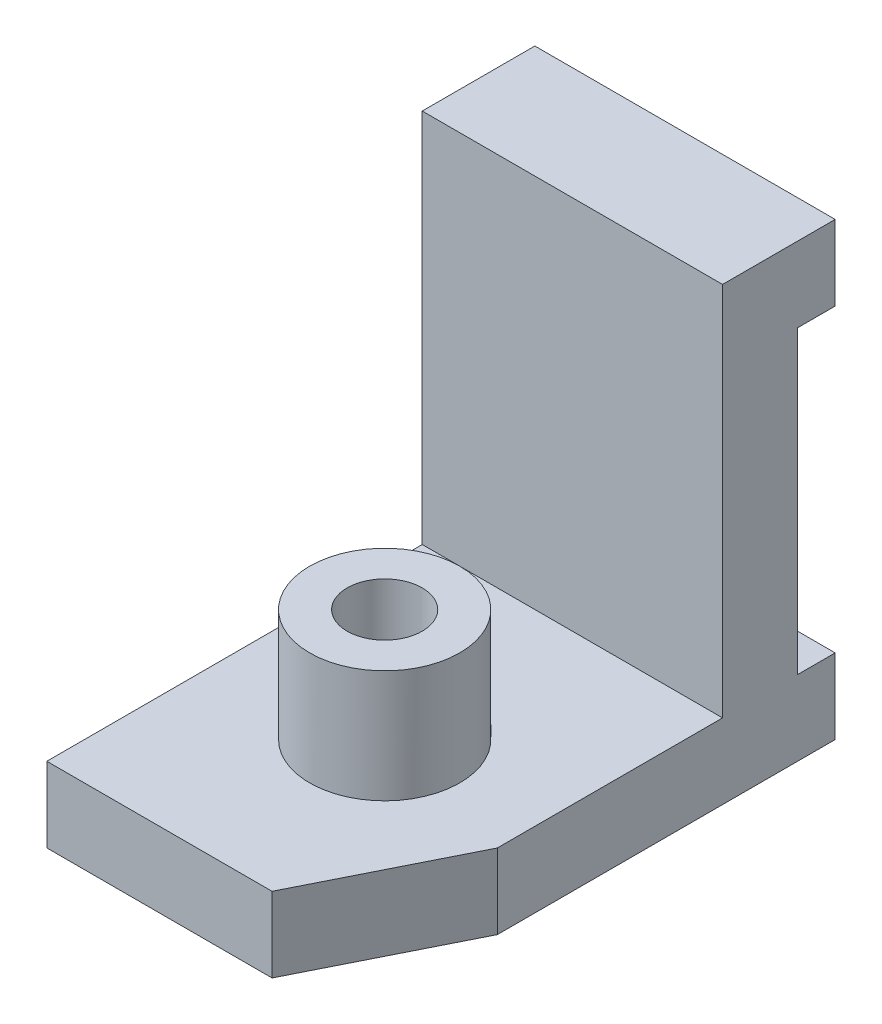
ISO-10303-21;
HEADER;
FILE_DESCRIPTION(('STEP AP214'),'2;1');
FILE_NAME('part.step','',(''),(''),'','','');
FILE_SCHEMA(('AUTOMOTIVE_DESIGN { 1 0 10303 214 1 1 1 1 }'));
ENDSEC;
DATA;
#1=APPLICATION_CONTEXT('core data for automotive mechanical design processes');
#2=APPLICATION_PROTOCOL_DEFINITION('international standard','automotive_design',2000,#1);
#3=PRODUCT_CONTEXT('',#1,'mechanical');
#4=PRODUCT('Part','Part','',(#3));
#5=PRODUCT_RELATED_PRODUCT_CATEGORY('part','',(#4));
#6=PRODUCT_DEFINITION_FORMATION('','',#4);
#7=PRODUCT_DEFINITION_CONTEXT('part definition',#1,'design');
#8=PRODUCT_DEFINITION('design','',#6,#7);
#9=PRODUCT_DEFINITION_SHAPE('','',#8);
#10=(LENGTH_UNIT() NAMED_UNIT(*) SI_UNIT(.MILLI.,.METRE.));
#11=(NAMED_UNIT(*) PLANE_ANGLE_UNIT() SI_UNIT($,.RADIAN.));
#12=(NAMED_UNIT(*) SI_UNIT($,.STERADIAN.) SOLID_ANGLE_UNIT());
#13=UNCERTAINTY_MEASURE_WITH_UNIT(LENGTH_MEASURE(1.E-05),#10,'distance_accuracy_value','');
#14=(GEOMETRIC_REPRESENTATION_CONTEXT(3) GLOBAL_UNCERTAINTY_ASSIGNED_CONTEXT((#13)) GLOBAL_UNIT_ASSIGNED_CONTEXT((#10,
#11,#12)) REPRESENTATION_CONTEXT('',''));
#15=CARTESIAN_POINT('',(0.,0.,0.));
#16=DIRECTION('',(0.,0.,1.));
#17=DIRECTION('',(1.,0.,0.));
#18=AXIS2_PLACEMENT_3D('',#15,#16,#17);
#19=CARTESIAN_POINT('',(40.,0.,65.));
#20=DIRECTION('',(0.,1.,0.));
#21=DIRECTION('',(0.,0.,1.));
#22=AXIS2_PLACEMENT_3D('',#19,#20,#21);
#23=PLANE('',#22);
#24=DIRECTION('',(0.,0.,-1.));
#25=VECTOR('',#24,1.);
#26=CARTESIAN_POINT('',(40.,0.,65.));
#27=LINE('',#26,#25);
#28=CARTESIAN_POINT('',(40.,0.,44.9999999999999));
#29=VERTEX_POINT('',#28);
#30=CARTESIAN_POINT('',(40.,0.,0.));
#31=VERTEX_POINT('',#30);
#32=EDGE_CURVE('E124',#29,#31,#27,.T.);
#33=ORIENTED_EDGE('',*,*,#32,.F.);
#34=DIRECTION('',(-0.447213595499956,0.,0.894427190999917));
#35=VECTOR('',#34,1.);
#36=CARTESIAN_POINT('',(40.,0.,44.9999999999999));
#37=LINE('',#36,#35);
#38=CARTESIAN_POINT('',(30.,0.,65.));
#39=VERTEX_POINT('',#38);
#40=EDGE_CURVE('E65',#29,#39,#37,.T.);
#41=ORIENTED_EDGE('',*,*,#40,.T.);
#42=DIRECTION('',(-1.,0.,0.));
#43=VECTOR('',#42,1.);
#44=CARTESIAN_POINT('',(40.,0.,65.));
#45=LINE('',#44,#43);
#46=CARTESIAN_POINT('',(0.,0.,65.));
#47=VERTEX_POINT('',#46);
#48=EDGE_CURVE('E166',#39,#47,#45,.T.);
#49=ORIENTED_EDGE('',*,*,#48,.T.);
#50=DIRECTION('',(0.,0.,-1.));
#51=VECTOR('',#50,1.);
#52=CARTESIAN_POINT('',(0.,0.,65.));
#53=LINE('',#52,#51);
#54=CARTESIAN_POINT('',(0.,0.,0.));
#55=VERTEX_POINT('',#54);
#56=EDGE_CURVE('E146',#47,#55,#53,.T.);
#57=ORIENTED_EDGE('',*,*,#56,.T.);
#58=DIRECTION('',(-1.,0.,0.));
#59=VECTOR('',#58,1.);
#60=CARTESIAN_POINT('',(40.,0.,0.));
#61=LINE('',#60,#59);
#62=EDGE_CURVE('E138',#31,#55,#61,.T.);
#63=ORIENTED_EDGE('',*,*,#62,.F.);
#64=EDGE_LOOP('',(#33,#41,#49,#57,#63));
#65=FACE_BOUND('',#64,.T.);
#66=ADVANCED_FACE('F41',(#65),#23,.F.);
#67=CARTESIAN_POINT('',(40.,0.,0.));
#68=DIRECTION('',(0.,0.,1.));
#69=DIRECTION('',(1.,0.,0.));
#70=AXIS2_PLACEMENT_3D('',#67,#68,#69);
#71=PLANE('',#70);
#72=DIRECTION('',(0.,1.,0.));
#73=VECTOR('',#72,1.);
#74=CARTESIAN_POINT('',(0.,0.,0.));
#75=LINE('',#74,#73);
#76=CARTESIAN_POINT('',(0.,10.,0.));
#77=VERTEX_POINT('',#76);
#78=EDGE_CURVE('E253',#55,#77,#75,.T.);
#79=ORIENTED_EDGE('',*,*,#78,.T.);
#80=DIRECTION('',(-1.,0.,0.));
#81=VECTOR('',#80,1.);
#82=CARTESIAN_POINT('',(40.,10.,0.));
#83=LINE('',#82,#81);
#84=CARTESIAN_POINT('',(40.,10.,0.));
#85=VERTEX_POINT('',#84);
#86=EDGE_CURVE('E141',#85,#77,#83,.T.);
#87=ORIENTED_EDGE('',*,*,#86,.F.);
#88=DIRECTION('',(0.,1.,0.));
#89=VECTOR('',#88,1.);
#90=CARTESIAN_POINT('',(40.,0.,0.));
#91=LINE('',#90,#89);
#92=EDGE_CURVE('E128',#31,#85,#91,.T.);
#93=ORIENTED_EDGE('',*,*,#92,.F.);
#94=ORIENTED_EDGE('',*,*,#62,.T.);
#95=EDGE_LOOP('',(#79,#87,#93,#94));
#96=FACE_BOUND('',#95,.T.);
#97=ADVANCED_FACE('F137',(#96),#71,.F.);
#98=CARTESIAN_POINT('',(40.,10.,0.));
#99=DIRECTION('',(0.,-1.,0.));
#100=DIRECTION('',(0.,0.,-1.));
#101=AXIS2_PLACEMENT_3D('',#98,#99,#100);
#102=PLANE('',#101);
#103=DIRECTION('',(0.,0.,1.));
#104=VECTOR('',#103,1.);
#105=CARTESIAN_POINT('',(0.,10.,0.));
#106=LINE('',#105,#104);
#107=CARTESIAN_POINT('',(0.,10.,5.));
#108=VERTEX_POINT('',#107);
#109=EDGE_CURVE('E255',#77,#108,#106,.T.);
#110=ORIENTED_EDGE('',*,*,#109,.T.);
#111=DIRECTION('',(-1.,0.,0.));
#112=VECTOR('',#111,1.);
#113=CARTESIAN_POINT('',(40.,10.,5.));
#114=LINE('',#113,#112);
#115=CARTESIAN_POINT('',(40.,10.,5.));
#116=VERTEX_POINT('',#115);
#117=EDGE_CURVE('E149',#116,#108,#114,.T.);
#118=ORIENTED_EDGE('',*,*,#117,.F.);
#119=DIRECTION('',(0.,0.,1.));
#120=VECTOR('',#119,1.);
#121=CARTESIAN_POINT('',(40.,10.,0.));
#122=LINE('',#121,#120);
#123=EDGE_CURVE('E143',#85,#116,#122,.T.);
#124=ORIENTED_EDGE('',*,*,#123,.F.);
#125=ORIENTED_EDGE('',*,*,#86,.T.);
#126=EDGE_LOOP('',(#110,#118,#124,#125));
#127=FACE_BOUND('',#126,.T.);
#128=ADVANCED_FACE('F187',(#127),#102,.F.);
#129=CARTESIAN_POINT('',(40.,10.,5.));
#130=DIRECTION('',(0.,0.,1.));
#131=DIRECTION('',(1.,0.,0.));
#132=AXIS2_PLACEMENT_3D('',#129,#130,#131);
#133=PLANE('',#132);
#134=DIRECTION('',(0.,1.,0.));
#135=VECTOR('',#134,1.);
#136=CARTESIAN_POINT('',(0.,10.,5.));
#137=LINE('',#136,#135);
#138=CARTESIAN_POINT('',(0.,50.,5.));
#139=VERTEX_POINT('',#138);
#140=EDGE_CURVE('E257',#108,#139,#137,.T.);
#141=ORIENTED_EDGE('',*,*,#140,.T.);
#142=DIRECTION('',(-1.,0.,0.));
#143=VECTOR('',#142,1.);
#144=CARTESIAN_POINT('',(40.,50.,5.));
#145=LINE('',#144,#143);
#146=CARTESIAN_POINT('',(40.,50.,5.));
#147=VERTEX_POINT('',#146);
#148=EDGE_CURVE('E284',#147,#139,#145,.T.);
#149=ORIENTED_EDGE('',*,*,#148,.F.);
#150=DIRECTION('',(0.,1.,0.));
#151=VECTOR('',#150,1.);
#152=CARTESIAN_POINT('',(40.,10.,5.));
#153=LINE('',#152,#151);
#154=EDGE_CURVE('E243',#116,#147,#153,.T.);
#155=ORIENTED_EDGE('',*,*,#154,.F.);
#156=ORIENTED_EDGE('',*,*,#117,.T.);
#157=EDGE_LOOP('',(#141,#149,#155,#156));
#158=FACE_BOUND('',#157,.T.);
#159=ADVANCED_FACE('F192',(#158),#133,.F.);
#160=CARTESIAN_POINT('',(40.,50.,5.));
#161=DIRECTION('',(0.,1.,0.));
#162=DIRECTION('',(0.,0.,1.));
#163=AXIS2_PLACEMENT_3D('',#160,#161,#162);
#164=PLANE('',#163);
#165=DIRECTION('',(0.,0.,-1.));
#166=VECTOR('',#165,1.);
#167=CARTESIAN_POINT('',(0.,50.,5.));
#168=LINE('',#167,#166);
#169=CARTESIAN_POINT('',(0.,50.,0.));
#170=VERTEX_POINT('',#169);
#171=EDGE_CURVE('E259',#139,#170,#168,.T.);
#172=ORIENTED_EDGE('',*,*,#171,.T.);
#173=DIRECTION('',(-1.,0.,0.));
#174=VECTOR('',#173,1.);
#175=CARTESIAN_POINT('',(40.,50.,0.));
#176=LINE('',#175,#174);
#177=CARTESIAN_POINT('',(40.,50.,0.));
#178=VERTEX_POINT('',#177);
#179=EDGE_CURVE('E281',#178,#170,#176,.T.);
#180=ORIENTED_EDGE('',*,*,#179,.F.);
#181=DIRECTION('',(0.,0.,-1.));
#182=VECTOR('',#181,1.);
#183=CARTESIAN_POINT('',(40.,50.,5.));
#184=LINE('',#183,#182);
#185=EDGE_CURVE('E245',#147,#178,#184,.T.);
#186=ORIENTED_EDGE('',*,*,#185,.F.);
#187=ORIENTED_EDGE('',*,*,#148,.T.);
#188=EDGE_LOOP('',(#172,#180,#186,#187));
#189=FACE_BOUND('',#188,.T.);
#190=ADVANCED_FACE('F196',(#189),#164,.F.);
#191=CARTESIAN_POINT('',(40.,50.,0.));
#192=DIRECTION('',(0.,0.,1.));
#193=DIRECTION('',(1.,0.,0.));
#194=AXIS2_PLACEMENT_3D('',#191,#192,#193);
#195=PLANE('',#194);
#196=DIRECTION('',(0.,1.,0.));
#197=VECTOR('',#196,1.);
#198=CARTESIAN_POINT('',(0.,50.,0.));
#199=LINE('',#198,#197);
#200=CARTESIAN_POINT('',(0.,60.,0.));
#201=VERTEX_POINT('',#200);
#202=EDGE_CURVE('E261',#170,#201,#199,.T.);
#203=ORIENTED_EDGE('',*,*,#202,.T.);
#204=DIRECTION('',(-1.,0.,0.));
#205=VECTOR('',#204,1.);
#206=CARTESIAN_POINT('',(40.,60.,0.));
#207=LINE('',#206,#205);
#208=CARTESIAN_POINT('',(40.,60.,0.));
#209=VERTEX_POINT('',#208);
#210=EDGE_CURVE('E278',#209,#201,#207,.T.);
#211=ORIENTED_EDGE('',*,*,#210,.F.);
#212=DIRECTION('',(0.,1.,0.));
#213=VECTOR('',#212,1.);
#214=CARTESIAN_POINT('',(40.,50.,0.));
#215=LINE('',#214,#213);
#216=EDGE_CURVE('E247',#178,#209,#215,.T.);
#217=ORIENTED_EDGE('',*,*,#216,.F.);
#218=ORIENTED_EDGE('',*,*,#179,.T.);
#219=EDGE_LOOP('',(#203,#211,#217,#218));
#220=FACE_BOUND('',#219,.T.);
#221=ADVANCED_FACE('F200',(#220),#195,.F.);
#222=CARTESIAN_POINT('',(40.,60.,0.));
#223=DIRECTION('',(0.,-1.,0.));
#224=DIRECTION('',(0.,0.,-1.));
#225=AXIS2_PLACEMENT_3D('',#222,#223,#224);
#226=PLANE('',#225);
#227=DIRECTION('',(0.,0.,1.));
#228=VECTOR('',#227,1.);
#229=CARTESIAN_POINT('',(0.,60.,0.));
#230=LINE('',#229,#228);
#231=CARTESIAN_POINT('',(0.,60.,15.));
#232=VERTEX_POINT('',#231);
#233=EDGE_CURVE('E263',#201,#232,#230,.T.);
#234=ORIENTED_EDGE('',*,*,#233,.T.);
#235=DIRECTION('',(-1.,0.,0.));
#236=VECTOR('',#235,1.);
#237=CARTESIAN_POINT('',(40.,60.,15.));
#238=LINE('',#237,#236);
#239=CARTESIAN_POINT('',(40.,60.,15.));
#240=VERTEX_POINT('',#239);
#241=EDGE_CURVE('E275',#240,#232,#238,.T.);
#242=ORIENTED_EDGE('',*,*,#241,.F.);
#243=DIRECTION('',(0.,0.,1.));
#244=VECTOR('',#243,1.);
#245=CARTESIAN_POINT('',(40.,60.,0.));
#246=LINE('',#245,#244);
#247=EDGE_CURVE('E249',#209,#240,#246,.T.);
#248=ORIENTED_EDGE('',*,*,#247,.F.);
#249=ORIENTED_EDGE('',*,*,#210,.T.);
#250=EDGE_LOOP('',(#234,#242,#248,#249));
#251=FACE_BOUND('',#250,.T.);
#252=ADVANCED_FACE('F204',(#251),#226,.F.);
#253=CARTESIAN_POINT('',(40.,60.,15.));
#254=DIRECTION('',(0.,0.,-1.));
#255=DIRECTION('',(0.,1.,0.));
#256=AXIS2_PLACEMENT_3D('',#253,#254,#255);
#257=PLANE('',#256);
#258=DIRECTION('',(0.,-1.,0.));
#259=VECTOR('',#258,1.);
#260=CARTESIAN_POINT('',(0.,60.,15.));
#261=LINE('',#260,#259);
#262=CARTESIAN_POINT('',(0.,10.,15.));
#263=VERTEX_POINT('',#262);
#264=EDGE_CURVE('E265',#232,#263,#261,.T.);
#265=ORIENTED_EDGE('',*,*,#264,.T.);
#266=DIRECTION('',(-1.,0.,0.));
#267=VECTOR('',#266,1.);
#268=CARTESIAN_POINT('',(40.,10.,15.));
#269=LINE('',#268,#267);
#270=CARTESIAN_POINT('',(40.,10.,15.));
#271=VERTEX_POINT('',#270);
#272=EDGE_CURVE('E273',#271,#263,#269,.T.);
#273=ORIENTED_EDGE('',*,*,#272,.F.);
#274=DIRECTION('',(0.,-1.,0.));
#275=VECTOR('',#274,1.);
#276=CARTESIAN_POINT('',(40.,60.,15.));
#277=LINE('',#276,#275);
#278=EDGE_CURVE('E164',#240,#271,#277,.T.);
#279=ORIENTED_EDGE('',*,*,#278,.F.);
#280=ORIENTED_EDGE('',*,*,#241,.T.);
#281=EDGE_LOOP('',(#265,#273,#279,#280));
#282=FACE_BOUND('',#281,.T.);
#283=ADVANCED_FACE('F208',(#282),#257,.F.);
#284=CARTESIAN_POINT('',(40.,10.,15.));
#285=DIRECTION('',(0.,-1.,0.));
#286=DIRECTION('',(0.,0.,-1.));
#287=AXIS2_PLACEMENT_3D('',#284,#285,#286);
#288=PLANE('',#287);
#289=CARTESIAN_POINT('',(20.,10.,40.));
#290=DIRECTION('',(0.,-1.,0.));
#291=DIRECTION('',(0.,0.,-1.));
#292=AXIS2_PLACEMENT_3D('',#289,#290,#291);
#293=CIRCLE('',#292,10.);
#294=CARTESIAN_POINT('',(20.,10.,30.));
#295=VERTEX_POINT('',#294);
#296=EDGE_CURVE('E11',#295,#295,#293,.F.);
#297=ORIENTED_EDGE('',*,*,#296,.F.);
#298=EDGE_LOOP('',(#297));
#299=FACE_BOUND('',#298,.T.);
#300=DIRECTION('',(-1.,0.,0.));
#301=VECTOR('',#300,1.);
#302=CARTESIAN_POINT('',(40.,10.,65.));
#303=LINE('',#302,#301);
#304=CARTESIAN_POINT('',(30.,10.,65.));
#305=VERTEX_POINT('',#304);
#306=CARTESIAN_POINT('',(0.,10.,65.));
#307=VERTEX_POINT('',#306);
#308=EDGE_CURVE('E161',#305,#307,#303,.T.);
#309=ORIENTED_EDGE('',*,*,#308,.F.);
#310=DIRECTION('',(0.447213595499956,0.,-0.894427190999917));
#311=VECTOR('',#310,1.);
#312=CARTESIAN_POINT('',(40.,10.,44.9999999999999));
#313=LINE('',#312,#311);
#314=CARTESIAN_POINT('',(40.,10.,44.9999999999999));
#315=VERTEX_POINT('',#314);
#316=EDGE_CURVE('E50',#305,#315,#313,.T.);
#317=ORIENTED_EDGE('',*,*,#316,.T.);
#318=DIRECTION('',(0.,0.,1.));
#319=VECTOR('',#318,1.);
#320=CARTESIAN_POINT('',(40.,10.,15.));
#321=LINE('',#320,#319);
#322=EDGE_CURVE('E159',#271,#315,#321,.T.);
#323=ORIENTED_EDGE('',*,*,#322,.F.);
#324=ORIENTED_EDGE('',*,*,#272,.T.);
#325=DIRECTION('',(0.,0.,1.));
#326=VECTOR('',#325,1.);
#327=CARTESIAN_POINT('',(0.,10.,15.));
#328=LINE('',#327,#326);
#329=EDGE_CURVE('E267',#263,#307,#328,.T.);
#330=ORIENTED_EDGE('',*,*,#329,.T.);
#331=EDGE_LOOP('',(#309,#317,#323,#324,#330));
#332=FACE_BOUND('',#331,.T.);
#333=ADVANCED_FACE('F157',(#299,#332),#288,.F.);
#334=CARTESIAN_POINT('',(40.,10.,65.));
#335=DIRECTION('',(0.,0.,-1.));
#336=DIRECTION('',(-1.,0.,0.));
#337=AXIS2_PLACEMENT_3D('',#334,#335,#336);
#338=PLANE('',#337);
#339=ORIENTED_EDGE('',*,*,#48,.F.);
#340=DIRECTION('',(0.,1.,0.));
#341=VECTOR('',#340,1.);
#342=CARTESIAN_POINT('',(30.,10.,65.));
#343=LINE('',#342,#341);
#344=EDGE_CURVE('E57',#39,#305,#343,.T.);
#345=ORIENTED_EDGE('',*,*,#344,.T.);
#346=ORIENTED_EDGE('',*,*,#308,.T.);
#347=DIRECTION('',(0.,-1.,0.));
#348=VECTOR('',#347,1.);
#349=CARTESIAN_POINT('',(0.,10.,65.));
#350=LINE('',#349,#348);
#351=EDGE_CURVE('E133',#307,#47,#350,.T.);
#352=ORIENTED_EDGE('',*,*,#351,.T.);
#353=EDGE_LOOP('',(#339,#345,#346,#352));
#354=FACE_BOUND('',#353,.T.);
#355=ADVANCED_FACE('F214',(#354),#338,.F.);
#356=CARTESIAN_POINT('',(40.,0.,0.));
#357=DIRECTION('',(1.,0.,0.));
#358=DIRECTION('',(0.,0.,-1.));
#359=AXIS2_PLACEMENT_3D('',#356,#357,#358);
#360=PLANE('',#359);
#361=ORIENTED_EDGE('',*,*,#322,.T.);
#362=DIRECTION('',(0.,-1.,0.));
#363=VECTOR('',#362,1.);
#364=CARTESIAN_POINT('',(40.,0.,44.9999999999999));
#365=LINE('',#364,#363);
#366=EDGE_CURVE('E131',#315,#29,#365,.T.);
#367=ORIENTED_EDGE('',*,*,#366,.T.);
#368=ORIENTED_EDGE('',*,*,#32,.T.);
#369=ORIENTED_EDGE('',*,*,#92,.T.);
#370=ORIENTED_EDGE('',*,*,#123,.T.);
#371=ORIENTED_EDGE('',*,*,#154,.T.);
#372=ORIENTED_EDGE('',*,*,#185,.T.);
#373=ORIENTED_EDGE('',*,*,#216,.T.);
#374=ORIENTED_EDGE('',*,*,#247,.T.);
#375=ORIENTED_EDGE('',*,*,#278,.T.);
#376=EDGE_LOOP('',(#361,#367,#368,#369,#370,#371,#372,#373,#374,#375));
#377=FACE_BOUND('',#376,.T.);
#378=ADVANCED_FACE('F127',(#377),#360,.T.);
#379=CARTESIAN_POINT('',(0.,0.,0.));
#380=DIRECTION('',(1.,0.,0.));
#381=DIRECTION('',(0.,0.,-1.));
#382=AXIS2_PLACEMENT_3D('',#379,#380,#381);
#383=PLANE('',#382);
#384=ORIENTED_EDGE('',*,*,#56,.F.);
#385=ORIENTED_EDGE('',*,*,#351,.F.);
#386=ORIENTED_EDGE('',*,*,#329,.F.);
#387=ORIENTED_EDGE('',*,*,#264,.F.);
#388=ORIENTED_EDGE('',*,*,#233,.F.);
#389=ORIENTED_EDGE('',*,*,#202,.F.);
#390=ORIENTED_EDGE('',*,*,#171,.F.);
#391=ORIENTED_EDGE('',*,*,#140,.F.);
#392=ORIENTED_EDGE('',*,*,#109,.F.);
#393=ORIENTED_EDGE('',*,*,#78,.F.);
#394=EDGE_LOOP('',(#384,#385,#386,#387,#388,#389,#390,#391,#392,#393));
#395=FACE_BOUND('',#394,.T.);
#396=ADVANCED_FACE('F170',(#395),#383,.F.);
#397=CARTESIAN_POINT('',(40.,0.,44.9999999999999));
#398=DIRECTION('',(0.894427190999917,0.,0.447213595499956));
#399=DIRECTION('',(0.,1.,0.));
#400=AXIS2_PLACEMENT_3D('',#397,#398,#399);
#401=PLANE('',#400);
#402=ORIENTED_EDGE('',*,*,#316,.F.);
#403=ORIENTED_EDGE('',*,*,#344,.F.);
#404=ORIENTED_EDGE('',*,*,#40,.F.);
#405=ORIENTED_EDGE('',*,*,#366,.F.);
#406=EDGE_LOOP('',(#402,#403,#404,#405));
#407=FACE_BOUND('',#406,.T.);
#408=ADVANCED_FACE('F44',(#407),#401,.T.);
#409=CARTESIAN_POINT('',(20.,25.,40.));
#410=DIRECTION('',(0.,1.,0.));
#411=DIRECTION('',(0.,0.,1.));
#412=AXIS2_PLACEMENT_3D('',#409,#410,#411);
#413=PLANE('',#412);
#414=CARTESIAN_POINT('',(20.,25.,40.));
#415=DIRECTION('',(0.,1.,0.));
#416=DIRECTION('',(0.,0.,1.));
#417=AXIS2_PLACEMENT_3D('',#414,#415,#416);
#418=CIRCLE('',#417,10.);
#419=CARTESIAN_POINT('',(20.,25.,50.));
#420=VERTEX_POINT('',#419);
#421=EDGE_CURVE('E237',#420,#420,#418,.T.);
#422=ORIENTED_EDGE('',*,*,#421,.T.);
#423=EDGE_LOOP('',(#422));
#424=FACE_BOUND('',#423,.T.);
#425=CARTESIAN_POINT('',(20.,25.,40.));
#426=DIRECTION('',(0.,1.,0.));
#427=DIRECTION('',(0.,0.,1.));
#428=AXIS2_PLACEMENT_3D('',#425,#426,#427);
#429=CIRCLE('',#428,5.);
#430=CARTESIAN_POINT('',(20.,25.,45.));
#431=VERTEX_POINT('',#430);
#432=EDGE_CURVE('E232',#431,#431,#429,.T.);
#433=ORIENTED_EDGE('',*,*,#432,.F.);
#434=EDGE_LOOP('',(#433));
#435=FACE_BOUND('',#434,.T.);
#436=ADVANCED_FACE('F169',(#424,#435),#413,.T.);
#437=CARTESIAN_POINT('',(20.,25.,40.));
#438=DIRECTION('',(0.,-1.,0.));
#439=DIRECTION('',(0.,0.,-1.));
#440=AXIS2_PLACEMENT_3D('',#437,#438,#439);
#441=CYLINDRICAL_SURFACE('',#440,10.);
#442=ORIENTED_EDGE('',*,*,#421,.F.);
#443=EDGE_LOOP('',(#442));
#444=FACE_BOUND('',#443,.T.);
#445=ORIENTED_EDGE('',*,*,#296,.T.);
#446=EDGE_LOOP('',(#445));
#447=FACE_BOUND('',#446,.T.);
#448=ADVANCED_FACE('F176',(#444,#447),#441,.T.);
#449=CARTESIAN_POINT('',(20.,25.,40.));
#450=DIRECTION('',(0.,-1.,0.));
#451=DIRECTION('',(0.,0.,-1.));
#452=AXIS2_PLACEMENT_3D('',#449,#450,#451);
#453=CYLINDRICAL_SURFACE('',#452,5.);
#454=ORIENTED_EDGE('',*,*,#432,.T.);
#455=EDGE_LOOP('',(#454));
#456=FACE_BOUND('',#455,.T.);
#457=CARTESIAN_POINT('',(20.,10.,40.));
#458=DIRECTION('',(0.,1.,0.));
#459=DIRECTION('',(0.,0.,1.));
#460=AXIS2_PLACEMENT_3D('',#457,#458,#459);
#461=CIRCLE('',#460,5.);
#462=CARTESIAN_POINT('',(20.,10.,45.));
#463=VERTEX_POINT('',#462);
#464=EDGE_CURVE('E235',#463,#463,#461,.T.);
#465=ORIENTED_EDGE('',*,*,#464,.F.);
#466=EDGE_LOOP('',(#465));
#467=FACE_BOUND('',#466,.T.);
#468=ADVANCED_FACE('F220',(#456,#467),#453,.F.);
#469=ORIENTED_EDGE('',*,*,#464,.T.);
#470=EDGE_LOOP('',(#469));
#471=FACE_BOUND('',#470,.T.);
#472=ADVANCED_FACE('F216',(#471),#288,.F.);
#473=CLOSED_SHELL('',(#66,#97,#128,#159,#190,#221,#252,#283,#333,#355,#378,#396,#408,#436,#448,
#468,#472));
#474=MANIFOLD_SOLID_BREP('B2',#473);
#475=ADVANCED_BREP_SHAPE_REPRESENTATION('',(#18,#474),#14);
#476=SHAPE_DEFINITION_REPRESENTATION(#9,#475);
ENDSEC;
END-ISO-10303-21;
